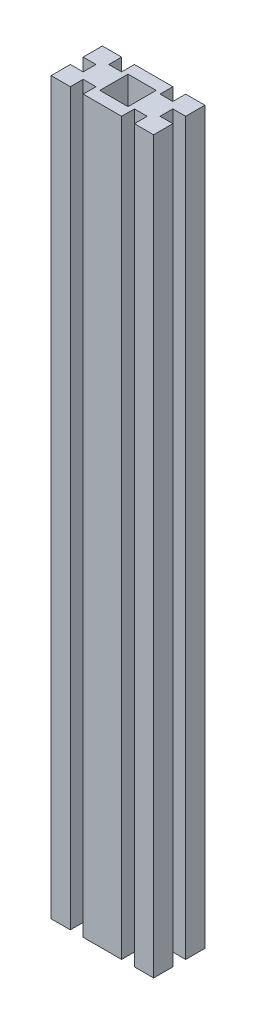
ISO-10303-21;
HEADER;
FILE_DESCRIPTION(('STEP AP214'),'2;1');
FILE_NAME('part.step','',(''),(''),'','','');
FILE_SCHEMA(('AUTOMOTIVE_DESIGN { 1 0 10303 214 1 1 1 1 }'));
ENDSEC;
DATA;
#1=APPLICATION_CONTEXT('core data for automotive mechanical design processes');
#2=APPLICATION_PROTOCOL_DEFINITION('international standard','automotive_design',2000,#1);
#3=PRODUCT_CONTEXT('',#1,'mechanical');
#4=PRODUCT('Part','Part','',(#3));
#5=PRODUCT_RELATED_PRODUCT_CATEGORY('part','',(#4));
#6=PRODUCT_DEFINITION_FORMATION('','',#4);
#7=PRODUCT_DEFINITION_CONTEXT('part definition',#1,'design');
#8=PRODUCT_DEFINITION('design','',#6,#7);
#9=PRODUCT_DEFINITION_SHAPE('','',#8);
#10=(LENGTH_UNIT() NAMED_UNIT(*) SI_UNIT(.MILLI.,.METRE.));
#11=(NAMED_UNIT(*) PLANE_ANGLE_UNIT() SI_UNIT($,.RADIAN.));
#12=(NAMED_UNIT(*) SI_UNIT($,.STERADIAN.) SOLID_ANGLE_UNIT());
#13=UNCERTAINTY_MEASURE_WITH_UNIT(LENGTH_MEASURE(1.E-05),#10,'distance_accuracy_value','');
#14=(GEOMETRIC_REPRESENTATION_CONTEXT(3) GLOBAL_UNCERTAINTY_ASSIGNED_CONTEXT((#13)) GLOBAL_UNIT_ASSIGNED_CONTEXT((#10,
#11,#12)) REPRESENTATION_CONTEXT('',''));
#15=CARTESIAN_POINT('',(0.,0.,0.));
#16=DIRECTION('',(0.,0.,1.));
#17=DIRECTION('',(1.,0.,0.));
#18=AXIS2_PLACEMENT_3D('',#15,#16,#17);
#19=CARTESIAN_POINT('',(-20.,285.,10.));
#20=DIRECTION('',(1.,0.,0.));
#21=DIRECTION('',(0.,0.,-1.));
#22=AXIS2_PLACEMENT_3D('',#19,#20,#21);
#23=PLANE('',#22);
#24=DIRECTION('',(0.,0.,1.));
#25=VECTOR('',#24,1.);
#26=CARTESIAN_POINT('',(-20.,0.,10.));
#27=LINE('',#26,#25);
#28=CARTESIAN_POINT('',(-20.,0.,-10.));
#29=VERTEX_POINT('',#28);
#30=CARTESIAN_POINT('',(-20.,0.,-2.5));
#31=VERTEX_POINT('',#30);
#32=EDGE_CURVE('E318',#29,#31,#27,.T.);
#33=ORIENTED_EDGE('',*,*,#32,.T.);
#34=DIRECTION('',(0.,1.,0.));
#35=VECTOR('',#34,1.);
#36=CARTESIAN_POINT('',(-20.,0.,-2.5));
#37=LINE('',#36,#35);
#38=CARTESIAN_POINT('',(-20.,285.,-2.5));
#39=VERTEX_POINT('',#38);
#40=EDGE_CURVE('E356',#31,#39,#37,.T.);
#41=ORIENTED_EDGE('',*,*,#40,.T.);
#42=DIRECTION('',(0.,0.,1.));
#43=VECTOR('',#42,1.);
#44=CARTESIAN_POINT('',(-20.,285.,10.));
#45=LINE('',#44,#43);
#46=CARTESIAN_POINT('',(-20.,285.,-10.));
#47=VERTEX_POINT('',#46);
#48=EDGE_CURVE('E337',#47,#39,#45,.T.);
#49=ORIENTED_EDGE('',*,*,#48,.F.);
#50=DIRECTION('',(0.,-1.,0.));
#51=VECTOR('',#50,1.);
#52=CARTESIAN_POINT('',(-20.,285.,-10.));
#53=LINE('',#52,#51);
#54=EDGE_CURVE('E281',#47,#29,#53,.T.);
#55=ORIENTED_EDGE('',*,*,#54,.T.);
#56=EDGE_LOOP('',(#33,#41,#49,#55));
#57=FACE_BOUND('',#56,.T.);
#58=ADVANCED_FACE('F35',(#57),#23,.F.);
#59=CARTESIAN_POINT('',(20.,285.,9.99999999999999));
#60=DIRECTION('',(0.,0.,-1.));
#61=DIRECTION('',(-1.,0.,0.));
#62=AXIS2_PLACEMENT_3D('',#59,#60,#61);
#63=PLANE('',#62);
#64=DIRECTION('',(1.,0.,0.));
#65=VECTOR('',#64,1.);
#66=CARTESIAN_POINT('',(20.,0.,9.99999999999999));
#67=LINE('',#66,#65);
#68=CARTESIAN_POINT('',(-20.,0.,10.));
#69=VERTEX_POINT('',#68);
#70=CARTESIAN_POINT('',(-12.5,0.,10.));
#71=VERTEX_POINT('',#70);
#72=EDGE_CURVE('E306',#69,#71,#67,.T.);
#73=ORIENTED_EDGE('',*,*,#72,.T.);
#74=DIRECTION('',(0.,1.,0.));
#75=VECTOR('',#74,1.);
#76=CARTESIAN_POINT('',(-12.5,0.,10.));
#77=LINE('',#76,#75);
#78=CARTESIAN_POINT('',(-12.5,285.,10.));
#79=VERTEX_POINT('',#78);
#80=EDGE_CURVE('E411',#71,#79,#77,.T.);
#81=ORIENTED_EDGE('',*,*,#80,.T.);
#82=DIRECTION('',(1.,0.,0.));
#83=VECTOR('',#82,1.);
#84=CARTESIAN_POINT('',(20.,285.,9.99999999999999));
#85=LINE('',#84,#83);
#86=CARTESIAN_POINT('',(-20.,285.,10.));
#87=VERTEX_POINT('',#86);
#88=EDGE_CURVE('E332',#87,#79,#85,.T.);
#89=ORIENTED_EDGE('',*,*,#88,.F.);
#90=DIRECTION('',(0.,-1.,0.));
#91=VECTOR('',#90,1.);
#92=CARTESIAN_POINT('',(-20.,285.,10.));
#93=LINE('',#92,#91);
#94=EDGE_CURVE('E11',#87,#69,#93,.T.);
#95=ORIENTED_EDGE('',*,*,#94,.T.);
#96=EDGE_LOOP('',(#73,#81,#89,#95));
#97=FACE_BOUND('',#96,.T.);
#98=ADVANCED_FACE('F549',(#97),#63,.F.);
#99=CARTESIAN_POINT('',(-7.5,285.,10.));
#100=VERTEX_POINT('',#99);
#101=CARTESIAN_POINT('',(7.5,285.,10.));
#102=VERTEX_POINT('',#101);
#103=EDGE_CURVE('E335',#100,#102,#85,.T.);
#104=ORIENTED_EDGE('',*,*,#103,.F.);
#105=DIRECTION('',(0.,1.,0.));
#106=VECTOR('',#105,1.);
#107=CARTESIAN_POINT('',(-7.5,0.,10.));
#108=LINE('',#107,#106);
#109=CARTESIAN_POINT('',(-7.5,0.,10.));
#110=VERTEX_POINT('',#109);
#111=EDGE_CURVE('E413',#110,#100,#108,.T.);
#112=ORIENTED_EDGE('',*,*,#111,.F.);
#113=CARTESIAN_POINT('',(7.5,0.,10.));
#114=VERTEX_POINT('',#113);
#115=EDGE_CURVE('E312',#110,#114,#67,.T.);
#116=ORIENTED_EDGE('',*,*,#115,.T.);
#117=DIRECTION('',(0.,1.,0.));
#118=VECTOR('',#117,1.);
#119=CARTESIAN_POINT('',(7.5,0.,10.));
#120=LINE('',#119,#118);
#121=EDGE_CURVE('E393',#114,#102,#120,.T.);
#122=ORIENTED_EDGE('',*,*,#121,.T.);
#123=EDGE_LOOP('',(#104,#112,#116,#122));
#124=FACE_BOUND('',#123,.T.);
#125=ADVANCED_FACE('F537',(#124),#63,.F.);
#126=CARTESIAN_POINT('',(20.,285.,9.99999999999999));
#127=DIRECTION('',(-1.,0.,0.));
#128=DIRECTION('',(0.,0.,1.));
#129=AXIS2_PLACEMENT_3D('',#126,#127,#128);
#130=PLANE('',#129);
#131=DIRECTION('',(0.,0.,-1.));
#132=VECTOR('',#131,1.);
#133=CARTESIAN_POINT('',(20.,285.,9.99999999999999));
#134=LINE('',#133,#132);
#135=CARTESIAN_POINT('',(20.,285.,-2.5));
#136=VERTEX_POINT('',#135);
#137=CARTESIAN_POINT('',(20.,285.,-10.));
#138=VERTEX_POINT('',#137);
#139=EDGE_CURVE('E331',#136,#138,#134,.T.);
#140=ORIENTED_EDGE('',*,*,#139,.F.);
#141=DIRECTION('',(0.,1.,0.));
#142=VECTOR('',#141,1.);
#143=CARTESIAN_POINT('',(20.,0.,-2.5));
#144=LINE('',#143,#142);
#145=CARTESIAN_POINT('',(20.,0.,-2.5));
#146=VERTEX_POINT('',#145);
#147=EDGE_CURVE('E368',#146,#136,#144,.T.);
#148=ORIENTED_EDGE('',*,*,#147,.F.);
#149=DIRECTION('',(0.,0.,-1.));
#150=VECTOR('',#149,1.);
#151=CARTESIAN_POINT('',(20.,0.,9.99999999999999));
#152=LINE('',#151,#150);
#153=CARTESIAN_POINT('',(20.,0.,-10.));
#154=VERTEX_POINT('',#153);
#155=EDGE_CURVE('E305',#146,#154,#152,.T.);
#156=ORIENTED_EDGE('',*,*,#155,.T.);
#157=DIRECTION('',(0.,-1.,0.));
#158=VECTOR('',#157,1.);
#159=CARTESIAN_POINT('',(20.,285.,-10.));
#160=LINE('',#159,#158);
#161=EDGE_CURVE('E284',#138,#154,#160,.T.);
#162=ORIENTED_EDGE('',*,*,#161,.F.);
#163=EDGE_LOOP('',(#140,#148,#156,#162));
#164=FACE_BOUND('',#163,.T.);
#165=ADVANCED_FACE('F518',(#164),#130,.F.);
#166=CARTESIAN_POINT('',(20.,285.,-10.));
#167=DIRECTION('',(0.,0.,1.));
#168=DIRECTION('',(1.,0.,0.));
#169=AXIS2_PLACEMENT_3D('',#166,#167,#168);
#170=PLANE('',#169);
#171=DIRECTION('',(-1.,0.,0.));
#172=VECTOR('',#171,1.);
#173=CARTESIAN_POINT('',(20.,0.,-10.));
#174=LINE('',#173,#172);
#175=CARTESIAN_POINT('',(12.5,0.,-10.));
#176=VERTEX_POINT('',#175);
#177=EDGE_CURVE('E272',#154,#176,#174,.T.);
#178=ORIENTED_EDGE('',*,*,#177,.T.);
#179=DIRECTION('',(0.,1.,0.));
#180=VECTOR('',#179,1.);
#181=CARTESIAN_POINT('',(12.5,0.,-10.));
#182=LINE('',#181,#180);
#183=CARTESIAN_POINT('',(12.5,285.,-10.));
#184=VERTEX_POINT('',#183);
#185=EDGE_CURVE('E380',#176,#184,#182,.T.);
#186=ORIENTED_EDGE('',*,*,#185,.T.);
#187=DIRECTION('',(-1.,0.,0.));
#188=VECTOR('',#187,1.);
#189=CARTESIAN_POINT('',(20.,285.,-10.));
#190=LINE('',#189,#188);
#191=EDGE_CURVE('E285',#138,#184,#190,.T.);
#192=ORIENTED_EDGE('',*,*,#191,.F.);
#193=ORIENTED_EDGE('',*,*,#161,.T.);
#194=EDGE_LOOP('',(#178,#186,#192,#193));
#195=FACE_BOUND('',#194,.T.);
#196=ADVANCED_FACE('F510',(#195),#170,.F.);
#197=CARTESIAN_POINT('',(-12.5,285.,-10.));
#198=VERTEX_POINT('',#197);
#199=EDGE_CURVE('E329',#198,#47,#190,.T.);
#200=ORIENTED_EDGE('',*,*,#199,.F.);
#201=DIRECTION('',(0.,1.,0.));
#202=VECTOR('',#201,1.);
#203=CARTESIAN_POINT('',(-12.5,0.,-10.));
#204=LINE('',#203,#202);
#205=CARTESIAN_POINT('',(-12.5,0.,-10.));
#206=VERTEX_POINT('',#205);
#207=EDGE_CURVE('E325',#206,#198,#204,.T.);
#208=ORIENTED_EDGE('',*,*,#207,.F.);
#209=EDGE_CURVE('E273',#206,#29,#174,.T.);
#210=ORIENTED_EDGE('',*,*,#209,.T.);
#211=ORIENTED_EDGE('',*,*,#54,.F.);
#212=EDGE_LOOP('',(#200,#208,#210,#211));
#213=FACE_BOUND('',#212,.T.);
#214=ADVANCED_FACE('F555',(#213),#170,.F.);
#215=CARTESIAN_POINT('',(-20.,285.,2.5));
#216=VERTEX_POINT('',#215);
#217=EDGE_CURVE('E276',#216,#87,#45,.T.);
#218=ORIENTED_EDGE('',*,*,#217,.F.);
#219=DIRECTION('',(0.,1.,0.));
#220=VECTOR('',#219,1.);
#221=CARTESIAN_POINT('',(-20.,0.,2.5));
#222=LINE('',#221,#220);
#223=CARTESIAN_POINT('',(-20.,0.,2.5));
#224=VERTEX_POINT('',#223);
#225=EDGE_CURVE('E436',#224,#216,#222,.T.);
#226=ORIENTED_EDGE('',*,*,#225,.F.);
#227=EDGE_CURVE('E321',#224,#69,#27,.T.);
#228=ORIENTED_EDGE('',*,*,#227,.T.);
#229=ORIENTED_EDGE('',*,*,#94,.F.);
#230=EDGE_LOOP('',(#218,#226,#228,#229));
#231=FACE_BOUND('',#230,.T.);
#232=ADVANCED_FACE('F37',(#231),#23,.F.);
#233=CARTESIAN_POINT('',(12.5,285.,10.));
#234=VERTEX_POINT('',#233);
#235=CARTESIAN_POINT('',(20.,285.,9.99999999999999));
#236=VERTEX_POINT('',#235);
#237=EDGE_CURVE('E336',#234,#236,#85,.T.);
#238=ORIENTED_EDGE('',*,*,#237,.F.);
#239=DIRECTION('',(0.,1.,0.));
#240=VECTOR('',#239,1.);
#241=CARTESIAN_POINT('',(12.5,0.,10.));
#242=LINE('',#241,#240);
#243=CARTESIAN_POINT('',(12.5,0.,10.));
#244=VERTEX_POINT('',#243);
#245=EDGE_CURVE('E386',#244,#234,#242,.T.);
#246=ORIENTED_EDGE('',*,*,#245,.F.);
#247=CARTESIAN_POINT('',(20.,0.,9.99999999999999));
#248=VERTEX_POINT('',#247);
#249=EDGE_CURVE('E302',#244,#248,#67,.T.);
#250=ORIENTED_EDGE('',*,*,#249,.T.);
#251=DIRECTION('',(0.,-1.,0.));
#252=VECTOR('',#251,1.);
#253=CARTESIAN_POINT('',(20.,285.,9.99999999999999));
#254=LINE('',#253,#252);
#255=EDGE_CURVE('E43',#236,#248,#254,.T.);
#256=ORIENTED_EDGE('',*,*,#255,.F.);
#257=EDGE_LOOP('',(#238,#246,#250,#256));
#258=FACE_BOUND('',#257,.T.);
#259=ADVANCED_FACE('F547',(#258),#63,.F.);
#260=CARTESIAN_POINT('',(20.,0.,2.5));
#261=VERTEX_POINT('',#260);
#262=EDGE_CURVE('E277',#248,#261,#152,.T.);
#263=ORIENTED_EDGE('',*,*,#262,.T.);
#264=DIRECTION('',(0.,1.,0.));
#265=VECTOR('',#264,1.);
#266=CARTESIAN_POINT('',(20.,0.,2.5));
#267=LINE('',#266,#265);
#268=CARTESIAN_POINT('',(20.,285.,2.5));
#269=VERTEX_POINT('',#268);
#270=EDGE_CURVE('E366',#261,#269,#267,.T.);
#271=ORIENTED_EDGE('',*,*,#270,.T.);
#272=EDGE_CURVE('E296',#236,#269,#134,.T.);
#273=ORIENTED_EDGE('',*,*,#272,.F.);
#274=ORIENTED_EDGE('',*,*,#255,.T.);
#275=EDGE_LOOP('',(#263,#271,#273,#274));
#276=FACE_BOUND('',#275,.T.);
#277=ADVANCED_FACE('F293',(#276),#130,.F.);
#278=CARTESIAN_POINT('',(7.5,285.,-10.));
#279=VERTEX_POINT('',#278);
#280=CARTESIAN_POINT('',(-7.5,285.,-10.));
#281=VERTEX_POINT('',#280);
#282=EDGE_CURVE('E264',#279,#281,#190,.T.);
#283=ORIENTED_EDGE('',*,*,#282,.F.);
#284=DIRECTION('',(0.,1.,0.));
#285=VECTOR('',#284,1.);
#286=CARTESIAN_POINT('',(7.5,0.,-10.));
#287=LINE('',#286,#285);
#288=CARTESIAN_POINT('',(7.5,0.,-10.));
#289=VERTEX_POINT('',#288);
#290=EDGE_CURVE('E248',#289,#279,#287,.T.);
#291=ORIENTED_EDGE('',*,*,#290,.F.);
#292=CARTESIAN_POINT('',(-7.5,0.,-10.));
#293=VERTEX_POINT('',#292);
#294=EDGE_CURVE('E262',#289,#293,#174,.T.);
#295=ORIENTED_EDGE('',*,*,#294,.T.);
#296=DIRECTION('',(0.,1.,0.));
#297=VECTOR('',#296,1.);
#298=CARTESIAN_POINT('',(-7.5,0.,-10.));
#299=LINE('',#298,#297);
#300=EDGE_CURVE('E344',#293,#281,#299,.T.);
#301=ORIENTED_EDGE('',*,*,#300,.T.);
#302=EDGE_LOOP('',(#283,#291,#295,#301));
#303=FACE_BOUND('',#302,.T.);
#304=ADVANCED_FACE('F260',(#303),#170,.F.);
#305=CARTESIAN_POINT('',(0.,285.,0.));
#306=DIRECTION('',(0.,1.,0.));
#307=DIRECTION('',(0.,0.,1.));
#308=AXIS2_PLACEMENT_3D('',#305,#306,#307);
#309=PLANE('',#308);
#310=DIRECTION('',(-1.,0.,0.));
#311=VECTOR('',#310,1.);
#312=CARTESIAN_POINT('',(-20.,285.,-2.5));
#313=LINE('',#312,#311);
#314=CARTESIAN_POINT('',(-15.,285.,-2.5));
#315=VERTEX_POINT('',#314);
#316=EDGE_CURVE('E444',#315,#39,#313,.T.);
#317=ORIENTED_EDGE('',*,*,#316,.F.);
#318=DIRECTION('',(0.,0.,-1.));
#319=VECTOR('',#318,1.);
#320=CARTESIAN_POINT('',(-15.,285.,-2.5));
#321=LINE('',#320,#319);
#322=CARTESIAN_POINT('',(-15.,285.,2.5));
#323=VERTEX_POINT('',#322);
#324=EDGE_CURVE('E447',#323,#315,#321,.T.);
#325=ORIENTED_EDGE('',*,*,#324,.F.);
#326=DIRECTION('',(1.,0.,0.));
#327=VECTOR('',#326,1.);
#328=CARTESIAN_POINT('',(-20.,285.,2.5));
#329=LINE('',#328,#327);
#330=EDGE_CURVE('E420',#216,#323,#329,.T.);
#331=ORIENTED_EDGE('',*,*,#330,.F.);
#332=ORIENTED_EDGE('',*,*,#217,.T.);
#333=ORIENTED_EDGE('',*,*,#88,.T.);
#334=DIRECTION('',(0.,0.,1.));
#335=VECTOR('',#334,1.);
#336=CARTESIAN_POINT('',(-12.5,285.,10.));
#337=LINE('',#336,#335);
#338=CARTESIAN_POINT('',(-12.5,285.,5.));
#339=VERTEX_POINT('',#338);
#340=EDGE_CURVE('E396',#339,#79,#337,.T.);
#341=ORIENTED_EDGE('',*,*,#340,.F.);
#342=DIRECTION('',(-1.,0.,0.));
#343=VECTOR('',#342,1.);
#344=CARTESIAN_POINT('',(-12.5,285.,5.));
#345=LINE('',#344,#343);
#346=CARTESIAN_POINT('',(-7.5,285.,5.));
#347=VERTEX_POINT('',#346);
#348=EDGE_CURVE('E421',#347,#339,#345,.T.);
#349=ORIENTED_EDGE('',*,*,#348,.F.);
#350=DIRECTION('',(0.,0.,-1.));
#351=VECTOR('',#350,1.);
#352=CARTESIAN_POINT('',(-7.5,285.,10.));
#353=LINE('',#352,#351);
#354=EDGE_CURVE('E425',#100,#347,#353,.T.);
#355=ORIENTED_EDGE('',*,*,#354,.F.);
#356=ORIENTED_EDGE('',*,*,#103,.T.);
#357=DIRECTION('',(0.,0.,1.));
#358=VECTOR('',#357,1.);
#359=CARTESIAN_POINT('',(7.5,285.,10.));
#360=LINE('',#359,#358);
#361=CARTESIAN_POINT('',(7.5,285.,5.));
#362=VERTEX_POINT('',#361);
#363=EDGE_CURVE('E397',#362,#102,#360,.T.);
#364=ORIENTED_EDGE('',*,*,#363,.F.);
#365=DIRECTION('',(-1.,0.,0.));
#366=VECTOR('',#365,1.);
#367=CARTESIAN_POINT('',(12.5,285.,5.));
#368=LINE('',#367,#366);
#369=CARTESIAN_POINT('',(12.5,285.,5.));
#370=VERTEX_POINT('',#369);
#371=EDGE_CURVE('E400',#370,#362,#368,.T.);
#372=ORIENTED_EDGE('',*,*,#371,.F.);
#373=DIRECTION('',(0.,0.,-1.));
#374=VECTOR('',#373,1.);
#375=CARTESIAN_POINT('',(12.5,285.,10.));
#376=LINE('',#375,#374);
#377=EDGE_CURVE('E370',#234,#370,#376,.T.);
#378=ORIENTED_EDGE('',*,*,#377,.F.);
#379=ORIENTED_EDGE('',*,*,#237,.T.);
#380=ORIENTED_EDGE('',*,*,#272,.T.);
#381=DIRECTION('',(1.,0.,0.));
#382=VECTOR('',#381,1.);
#383=CARTESIAN_POINT('',(20.,285.,2.5));
#384=LINE('',#383,#382);
#385=CARTESIAN_POINT('',(15.,285.,2.5));
#386=VERTEX_POINT('',#385);
#387=EDGE_CURVE('E371',#386,#269,#384,.T.);
#388=ORIENTED_EDGE('',*,*,#387,.F.);
#389=DIRECTION('',(0.,0.,1.));
#390=VECTOR('',#389,1.);
#391=CARTESIAN_POINT('',(15.,285.,-2.5));
#392=LINE('',#391,#390);
#393=CARTESIAN_POINT('',(15.,285.,-2.5));
#394=VERTEX_POINT('',#393);
#395=EDGE_CURVE('E374',#394,#386,#392,.T.);
#396=ORIENTED_EDGE('',*,*,#395,.F.);
#397=DIRECTION('',(-1.,0.,0.));
#398=VECTOR('',#397,1.);
#399=CARTESIAN_POINT('',(20.,285.,-2.5));
#400=LINE('',#399,#398);
#401=EDGE_CURVE('E377',#136,#394,#400,.T.);
#402=ORIENTED_EDGE('',*,*,#401,.F.);
#403=ORIENTED_EDGE('',*,*,#139,.T.);
#404=ORIENTED_EDGE('',*,*,#191,.T.);
#405=DIRECTION('',(0.,0.,-1.));
#406=VECTOR('',#405,1.);
#407=CARTESIAN_POINT('',(12.5,285.,-10.));
#408=LINE('',#407,#406);
#409=CARTESIAN_POINT('',(12.5,285.,-5.00000000000001));
#410=VERTEX_POINT('',#409);
#411=EDGE_CURVE('E255',#410,#184,#408,.T.);
#412=ORIENTED_EDGE('',*,*,#411,.F.);
#413=DIRECTION('',(1.,0.,0.));
#414=VECTOR('',#413,1.);
#415=CARTESIAN_POINT('',(12.5,285.,-5.00000000000001));
#416=LINE('',#415,#414);
#417=CARTESIAN_POINT('',(7.5,285.,-5.00000000000001));
#418=VERTEX_POINT('',#417);
#419=EDGE_CURVE('E494',#418,#410,#416,.T.);
#420=ORIENTED_EDGE('',*,*,#419,.F.);
#421=DIRECTION('',(0.,0.,1.));
#422=VECTOR('',#421,1.);
#423=CARTESIAN_POINT('',(7.5,285.,-10.));
#424=LINE('',#423,#422);
#425=EDGE_CURVE('E466',#279,#418,#424,.T.);
#426=ORIENTED_EDGE('',*,*,#425,.F.);
#427=ORIENTED_EDGE('',*,*,#282,.T.);
#428=DIRECTION('',(0.,0.,-1.));
#429=VECTOR('',#428,1.);
#430=CARTESIAN_POINT('',(-7.5,285.,-10.));
#431=LINE('',#430,#429);
#432=CARTESIAN_POINT('',(-7.5,285.,-5.00000000000001));
#433=VERTEX_POINT('',#432);
#434=EDGE_CURVE('E347',#433,#281,#431,.T.);
#435=ORIENTED_EDGE('',*,*,#434,.F.);
#436=DIRECTION('',(1.,0.,0.));
#437=VECTOR('',#436,1.);
#438=CARTESIAN_POINT('',(-12.5,285.,-5.00000000000001));
#439=LINE('',#438,#437);
#440=CARTESIAN_POINT('',(-12.5,285.,-5.00000000000001));
#441=VERTEX_POINT('',#440);
#442=EDGE_CURVE('E350',#441,#433,#439,.T.);
#443=ORIENTED_EDGE('',*,*,#442,.F.);
#444=DIRECTION('',(0.,0.,1.));
#445=VECTOR('',#444,1.);
#446=CARTESIAN_POINT('',(-12.5,285.,-10.));
#447=LINE('',#446,#445);
#448=EDGE_CURVE('E353',#198,#441,#447,.T.);
#449=ORIENTED_EDGE('',*,*,#448,.F.);
#450=ORIENTED_EDGE('',*,*,#199,.T.);
#451=ORIENTED_EDGE('',*,*,#48,.T.);
#452=EDGE_LOOP('',(#317,#325,#331,#332,#333,#341,#349,#355,#356,#364,#372,#378,#379,#380,#388,
#396,#402,#403,#404,#412,#420,#426,#427,#435,#443,#449,#450,#451));
#453=FACE_BOUND('',#452,.T.);
#454=DIRECTION('',(0.,0.,1.));
#455=VECTOR('',#454,1.);
#456=CARTESIAN_POINT('',(-5.5,285.,-5.5));
#457=LINE('',#456,#455);
#458=CARTESIAN_POINT('',(-5.5,285.,-5.5));
#459=VERTEX_POINT('',#458);
#460=CARTESIAN_POINT('',(-5.5,285.,5.5));
#461=VERTEX_POINT('',#460);
#462=EDGE_CURVE('E50',#459,#461,#457,.T.);
#463=ORIENTED_EDGE('',*,*,#462,.F.);
#464=DIRECTION('',(-1.,0.,0.));
#465=VECTOR('',#464,1.);
#466=CARTESIAN_POINT('',(5.5,285.,-5.5));
#467=LINE('',#466,#465);
#468=CARTESIAN_POINT('',(5.5,285.,-5.5));
#469=VERTEX_POINT('',#468);
#470=EDGE_CURVE('E467',#469,#459,#467,.T.);
#471=ORIENTED_EDGE('',*,*,#470,.F.);
#472=DIRECTION('',(0.,0.,-1.));
#473=VECTOR('',#472,1.);
#474=CARTESIAN_POINT('',(5.5,285.,-5.5));
#475=LINE('',#474,#473);
#476=CARTESIAN_POINT('',(5.5,285.,5.5));
#477=VERTEX_POINT('',#476);
#478=EDGE_CURVE('E471',#477,#469,#475,.T.);
#479=ORIENTED_EDGE('',*,*,#478,.F.);
#480=DIRECTION('',(1.,0.,0.));
#481=VECTOR('',#480,1.);
#482=CARTESIAN_POINT('',(5.5,285.,5.5));
#483=LINE('',#482,#481);
#484=EDGE_CURVE('E474',#461,#477,#483,.T.);
#485=ORIENTED_EDGE('',*,*,#484,.F.);
#486=EDGE_LOOP('',(#463,#471,#479,#485));
#487=FACE_BOUND('',#486,.T.);
#488=ADVANCED_FACE('F513',(#453,#487),#309,.T.);
#489=CARTESIAN_POINT('',(0.,0.,0.));
#490=DIRECTION('',(0.,1.,0.));
#491=DIRECTION('',(0.,0.,1.));
#492=AXIS2_PLACEMENT_3D('',#489,#490,#491);
#493=PLANE('',#492);
#494=DIRECTION('',(0.,0.,-1.));
#495=VECTOR('',#494,1.);
#496=CARTESIAN_POINT('',(-15.,0.,-2.5));
#497=LINE('',#496,#495);
#498=CARTESIAN_POINT('',(-15.,0.,2.5));
#499=VERTEX_POINT('',#498);
#500=CARTESIAN_POINT('',(-15.,0.,-2.5));
#501=VERTEX_POINT('',#500);
#502=EDGE_CURVE('E58',#499,#501,#497,.T.);
#503=ORIENTED_EDGE('',*,*,#502,.T.);
#504=DIRECTION('',(-1.,0.,0.));
#505=VECTOR('',#504,1.);
#506=CARTESIAN_POINT('',(-20.,0.,-2.5));
#507=LINE('',#506,#505);
#508=EDGE_CURVE('E439',#501,#31,#507,.T.);
#509=ORIENTED_EDGE('',*,*,#508,.T.);
#510=ORIENTED_EDGE('',*,*,#32,.F.);
#511=ORIENTED_EDGE('',*,*,#209,.F.);
#512=DIRECTION('',(0.,0.,1.));
#513=VECTOR('',#512,1.);
#514=CARTESIAN_POINT('',(-12.5,0.,-10.));
#515=LINE('',#514,#513);
#516=CARTESIAN_POINT('',(-12.5,0.,-5.00000000000001));
#517=VERTEX_POINT('',#516);
#518=EDGE_CURVE('E349',#206,#517,#515,.T.);
#519=ORIENTED_EDGE('',*,*,#518,.T.);
#520=DIRECTION('',(1.,0.,0.));
#521=VECTOR('',#520,1.);
#522=CARTESIAN_POINT('',(-12.5,0.,-5.00000000000001));
#523=LINE('',#522,#521);
#524=CARTESIAN_POINT('',(-7.5,0.,-5.00000000000001));
#525=VERTEX_POINT('',#524);
#526=EDGE_CURVE('E358',#517,#525,#523,.T.);
#527=ORIENTED_EDGE('',*,*,#526,.T.);
#528=DIRECTION('',(0.,0.,-1.));
#529=VECTOR('',#528,1.);
#530=CARTESIAN_POINT('',(-7.5,0.,-10.));
#531=LINE('',#530,#529);
#532=EDGE_CURVE('E271',#525,#293,#531,.T.);
#533=ORIENTED_EDGE('',*,*,#532,.T.);
#534=ORIENTED_EDGE('',*,*,#294,.F.);
#535=DIRECTION('',(0.,0.,1.));
#536=VECTOR('',#535,1.);
#537=CARTESIAN_POINT('',(7.5,0.,-10.));
#538=LINE('',#537,#536);
#539=CARTESIAN_POINT('',(7.5,0.,-5.00000000000001));
#540=VERTEX_POINT('',#539);
#541=EDGE_CURVE('E244',#289,#540,#538,.T.);
#542=ORIENTED_EDGE('',*,*,#541,.T.);
#543=DIRECTION('',(1.,0.,0.));
#544=VECTOR('',#543,1.);
#545=CARTESIAN_POINT('',(12.5,0.,-5.00000000000001));
#546=LINE('',#545,#544);
#547=CARTESIAN_POINT('',(12.5,0.,-5.00000000000001));
#548=VERTEX_POINT('',#547);
#549=EDGE_CURVE('E254',#540,#548,#546,.T.);
#550=ORIENTED_EDGE('',*,*,#549,.T.);
#551=DIRECTION('',(0.,0.,-1.));
#552=VECTOR('',#551,1.);
#553=CARTESIAN_POINT('',(12.5,0.,-10.));
#554=LINE('',#553,#552);
#555=EDGE_CURVE('E265',#548,#176,#554,.T.);
#556=ORIENTED_EDGE('',*,*,#555,.T.);
#557=ORIENTED_EDGE('',*,*,#177,.F.);
#558=ORIENTED_EDGE('',*,*,#155,.F.);
#559=DIRECTION('',(-1.,0.,0.));
#560=VECTOR('',#559,1.);
#561=CARTESIAN_POINT('',(20.,0.,-2.5));
#562=LINE('',#561,#560);
#563=CARTESIAN_POINT('',(15.,0.,-2.5));
#564=VERTEX_POINT('',#563);
#565=EDGE_CURVE('E373',#146,#564,#562,.T.);
#566=ORIENTED_EDGE('',*,*,#565,.T.);
#567=DIRECTION('',(0.,0.,1.));
#568=VECTOR('',#567,1.);
#569=CARTESIAN_POINT('',(15.,0.,-2.5));
#570=LINE('',#569,#568);
#571=CARTESIAN_POINT('',(15.,0.,2.5));
#572=VERTEX_POINT('',#571);
#573=EDGE_CURVE('E382',#564,#572,#570,.T.);
#574=ORIENTED_EDGE('',*,*,#573,.T.);
#575=DIRECTION('',(1.,0.,0.));
#576=VECTOR('',#575,1.);
#577=CARTESIAN_POINT('',(20.,0.,2.5));
#578=LINE('',#577,#576);
#579=EDGE_CURVE('E304',#572,#261,#578,.T.);
#580=ORIENTED_EDGE('',*,*,#579,.T.);
#581=ORIENTED_EDGE('',*,*,#262,.F.);
#582=ORIENTED_EDGE('',*,*,#249,.F.);
#583=DIRECTION('',(0.,0.,-1.));
#584=VECTOR('',#583,1.);
#585=CARTESIAN_POINT('',(12.5,0.,10.));
#586=LINE('',#585,#584);
#587=CARTESIAN_POINT('',(12.5,0.,5.));
#588=VERTEX_POINT('',#587);
#589=EDGE_CURVE('E399',#244,#588,#586,.T.);
#590=ORIENTED_EDGE('',*,*,#589,.T.);
#591=DIRECTION('',(-1.,0.,0.));
#592=VECTOR('',#591,1.);
#593=CARTESIAN_POINT('',(12.5,0.,5.));
#594=LINE('',#593,#592);
#595=CARTESIAN_POINT('',(7.5,0.,5.));
#596=VERTEX_POINT('',#595);
#597=EDGE_CURVE('E407',#588,#596,#594,.T.);
#598=ORIENTED_EDGE('',*,*,#597,.T.);
#599=DIRECTION('',(0.,0.,1.));
#600=VECTOR('',#599,1.);
#601=CARTESIAN_POINT('',(7.5,0.,10.));
#602=LINE('',#601,#600);
#603=EDGE_CURVE('E389',#596,#114,#602,.T.);
#604=ORIENTED_EDGE('',*,*,#603,.T.);
#605=ORIENTED_EDGE('',*,*,#115,.F.);
#606=DIRECTION('',(0.,0.,-1.));
#607=VECTOR('',#606,1.);
#608=CARTESIAN_POINT('',(-7.5,0.,10.));
#609=LINE('',#608,#607);
#610=CARTESIAN_POINT('',(-7.5,0.,5.));
#611=VERTEX_POINT('',#610);
#612=EDGE_CURVE('E431',#110,#611,#609,.T.);
#613=ORIENTED_EDGE('',*,*,#612,.T.);
#614=DIRECTION('',(-1.,0.,0.));
#615=VECTOR('',#614,1.);
#616=CARTESIAN_POINT('',(-12.5,0.,5.));
#617=LINE('',#616,#615);
#618=CARTESIAN_POINT('',(-12.5,0.,5.));
#619=VERTEX_POINT('',#618);
#620=EDGE_CURVE('E414',#611,#619,#617,.T.);
#621=ORIENTED_EDGE('',*,*,#620,.T.);
#622=DIRECTION('',(0.,0.,1.));
#623=VECTOR('',#622,1.);
#624=CARTESIAN_POINT('',(-12.5,0.,10.));
#625=LINE('',#624,#623);
#626=EDGE_CURVE('E424',#619,#71,#625,.T.);
#627=ORIENTED_EDGE('',*,*,#626,.T.);
#628=ORIENTED_EDGE('',*,*,#72,.F.);
#629=ORIENTED_EDGE('',*,*,#227,.F.);
#630=DIRECTION('',(1.,0.,0.));
#631=VECTOR('',#630,1.);
#632=CARTESIAN_POINT('',(-20.,0.,2.5));
#633=LINE('',#632,#631);
#634=EDGE_CURVE('E446',#224,#499,#633,.T.);
#635=ORIENTED_EDGE('',*,*,#634,.T.);
#636=EDGE_LOOP('',(#503,#509,#510,#511,#519,#527,#533,#534,#542,#550,#556,#557,#558,#566,#574,
#580,#581,#582,#590,#598,#604,#605,#613,#621,#627,#628,#629,#635));
#637=FACE_BOUND('',#636,.T.);
#638=DIRECTION('',(-1.,0.,0.));
#639=VECTOR('',#638,1.);
#640=CARTESIAN_POINT('',(5.5,0.,-5.5));
#641=LINE('',#640,#639);
#642=CARTESIAN_POINT('',(5.5,0.,-5.5));
#643=VERTEX_POINT('',#642);
#644=CARTESIAN_POINT('',(-5.5,0.,-5.5));
#645=VERTEX_POINT('',#644);
#646=EDGE_CURVE('E460',#643,#645,#641,.T.);
#647=ORIENTED_EDGE('',*,*,#646,.T.);
#648=DIRECTION('',(0.,0.,1.));
#649=VECTOR('',#648,1.);
#650=CARTESIAN_POINT('',(-5.5,0.,-5.5));
#651=LINE('',#650,#649);
#652=CARTESIAN_POINT('',(-5.5,0.,5.5));
#653=VERTEX_POINT('',#652);
#654=EDGE_CURVE('E470',#645,#653,#651,.T.);
#655=ORIENTED_EDGE('',*,*,#654,.T.);
#656=DIRECTION('',(1.,0.,0.));
#657=VECTOR('',#656,1.);
#658=CARTESIAN_POINT('',(5.5,0.,5.5));
#659=LINE('',#658,#657);
#660=CARTESIAN_POINT('',(5.5,0.,5.5));
#661=VERTEX_POINT('',#660);
#662=EDGE_CURVE('E483',#653,#661,#659,.T.);
#663=ORIENTED_EDGE('',*,*,#662,.T.);
#664=DIRECTION('',(0.,0.,-1.));
#665=VECTOR('',#664,1.);
#666=CARTESIAN_POINT('',(5.5,0.,-5.5));
#667=LINE('',#666,#665);
#668=EDGE_CURVE('E480',#661,#643,#667,.T.);
#669=ORIENTED_EDGE('',*,*,#668,.T.);
#670=EDGE_LOOP('',(#647,#655,#663,#669));
#671=FACE_BOUND('',#670,.T.);
#672=ADVANCED_FACE('F268',(#637,#671),#493,.F.);
#673=CARTESIAN_POINT('',(-12.5,0.,-10.));
#674=DIRECTION('',(-1.,0.,0.));
#675=DIRECTION('',(0.,0.,1.));
#676=AXIS2_PLACEMENT_3D('',#673,#674,#675);
#677=PLANE('',#676);
#678=ORIENTED_EDGE('',*,*,#448,.T.);
#679=DIRECTION('',(0.,1.,0.));
#680=VECTOR('',#679,1.);
#681=CARTESIAN_POINT('',(-12.5,0.,-5.00000000000001));
#682=LINE('',#681,#680);
#683=EDGE_CURVE('E340',#517,#441,#682,.T.);
#684=ORIENTED_EDGE('',*,*,#683,.F.);
#685=ORIENTED_EDGE('',*,*,#518,.F.);
#686=ORIENTED_EDGE('',*,*,#207,.T.);
#687=EDGE_LOOP('',(#678,#684,#685,#686));
#688=FACE_BOUND('',#687,.T.);
#689=ADVANCED_FACE('F625',(#688),#677,.F.);
#690=CARTESIAN_POINT('',(-7.5,0.,-10.));
#691=DIRECTION('',(1.,0.,0.));
#692=DIRECTION('',(0.,0.,-1.));
#693=AXIS2_PLACEMENT_3D('',#690,#691,#692);
#694=PLANE('',#693);
#695=ORIENTED_EDGE('',*,*,#434,.T.);
#696=ORIENTED_EDGE('',*,*,#300,.F.);
#697=ORIENTED_EDGE('',*,*,#532,.F.);
#698=DIRECTION('',(0.,1.,0.));
#699=VECTOR('',#698,1.);
#700=CARTESIAN_POINT('',(-7.5,0.,-5.00000000000001));
#701=LINE('',#700,#699);
#702=EDGE_CURVE('E342',#525,#433,#701,.T.);
#703=ORIENTED_EDGE('',*,*,#702,.T.);
#704=EDGE_LOOP('',(#695,#696,#697,#703));
#705=FACE_BOUND('',#704,.T.);
#706=ADVANCED_FACE('F634',(#705),#694,.F.);
#707=CARTESIAN_POINT('',(-12.5,0.,-5.00000000000001));
#708=DIRECTION('',(0.,0.,1.));
#709=DIRECTION('',(1.,0.,0.));
#710=AXIS2_PLACEMENT_3D('',#707,#708,#709);
#711=PLANE('',#710);
#712=ORIENTED_EDGE('',*,*,#442,.T.);
#713=ORIENTED_EDGE('',*,*,#702,.F.);
#714=ORIENTED_EDGE('',*,*,#526,.F.);
#715=ORIENTED_EDGE('',*,*,#683,.T.);
#716=EDGE_LOOP('',(#712,#713,#714,#715));
#717=FACE_BOUND('',#716,.T.);
#718=ADVANCED_FACE('F644',(#717),#711,.F.);
#719=CARTESIAN_POINT('',(-5.5,0.,-5.5));
#720=DIRECTION('',(-1.,0.,0.));
#721=DIRECTION('',(0.,0.,1.));
#722=AXIS2_PLACEMENT_3D('',#719,#720,#721);
#723=PLANE('',#722);
#724=ORIENTED_EDGE('',*,*,#462,.T.);
#725=DIRECTION('',(0.,1.,0.));
#726=VECTOR('',#725,1.);
#727=CARTESIAN_POINT('',(-5.5,0.,5.5));
#728=LINE('',#727,#726);
#729=EDGE_CURVE('E457',#653,#461,#728,.T.);
#730=ORIENTED_EDGE('',*,*,#729,.F.);
#731=ORIENTED_EDGE('',*,*,#654,.F.);
#732=DIRECTION('',(0.,1.,0.));
#733=VECTOR('',#732,1.);
#734=CARTESIAN_POINT('',(-5.5,0.,-5.5));
#735=LINE('',#734,#733);
#736=EDGE_CURVE('E464',#645,#459,#735,.T.);
#737=ORIENTED_EDGE('',*,*,#736,.T.);
#738=EDGE_LOOP('',(#724,#730,#731,#737));
#739=FACE_BOUND('',#738,.T.);
#740=ADVANCED_FACE('F654',(#739),#723,.F.);
#741=CARTESIAN_POINT('',(5.5,0.,-5.5));
#742=DIRECTION('',(0.,0.,-1.));
#743=DIRECTION('',(-1.,0.,0.));
#744=AXIS2_PLACEMENT_3D('',#741,#742,#743);
#745=PLANE('',#744);
#746=ORIENTED_EDGE('',*,*,#470,.T.);
#747=ORIENTED_EDGE('',*,*,#736,.F.);
#748=ORIENTED_EDGE('',*,*,#646,.F.);
#749=DIRECTION('',(0.,1.,0.));
#750=VECTOR('',#749,1.);
#751=CARTESIAN_POINT('',(5.5,0.,-5.5));
#752=LINE('',#751,#750);
#753=EDGE_CURVE('E462',#643,#469,#752,.T.);
#754=ORIENTED_EDGE('',*,*,#753,.T.);
#755=EDGE_LOOP('',(#746,#747,#748,#754));
#756=FACE_BOUND('',#755,.T.);
#757=ADVANCED_FACE('F664',(#756),#745,.F.);
#758=CARTESIAN_POINT('',(5.5,0.,-5.5));
#759=DIRECTION('',(1.,0.,0.));
#760=DIRECTION('',(0.,0.,-1.));
#761=AXIS2_PLACEMENT_3D('',#758,#759,#760);
#762=PLANE('',#761);
#763=ORIENTED_EDGE('',*,*,#478,.T.);
#764=ORIENTED_EDGE('',*,*,#753,.F.);
#765=ORIENTED_EDGE('',*,*,#668,.F.);
#766=DIRECTION('',(0.,1.,0.));
#767=VECTOR('',#766,1.);
#768=CARTESIAN_POINT('',(5.5,0.,5.5));
#769=LINE('',#768,#767);
#770=EDGE_CURVE('E459',#661,#477,#769,.T.);
#771=ORIENTED_EDGE('',*,*,#770,.T.);
#772=EDGE_LOOP('',(#763,#764,#765,#771));
#773=FACE_BOUND('',#772,.T.);
#774=ADVANCED_FACE('F673',(#773),#762,.F.);
#775=CARTESIAN_POINT('',(5.5,0.,5.5));
#776=DIRECTION('',(0.,0.,1.));
#777=DIRECTION('',(1.,0.,0.));
#778=AXIS2_PLACEMENT_3D('',#775,#776,#777);
#779=PLANE('',#778);
#780=ORIENTED_EDGE('',*,*,#484,.T.);
#781=ORIENTED_EDGE('',*,*,#770,.F.);
#782=ORIENTED_EDGE('',*,*,#662,.F.);
#783=ORIENTED_EDGE('',*,*,#729,.T.);
#784=EDGE_LOOP('',(#780,#781,#782,#783));
#785=FACE_BOUND('',#784,.T.);
#786=ADVANCED_FACE('F683',(#785),#779,.F.);
#787=CARTESIAN_POINT('',(12.5,0.,-10.));
#788=DIRECTION('',(1.,0.,0.));
#789=DIRECTION('',(0.,0.,-1.));
#790=AXIS2_PLACEMENT_3D('',#787,#788,#789);
#791=PLANE('',#790);
#792=ORIENTED_EDGE('',*,*,#411,.T.);
#793=ORIENTED_EDGE('',*,*,#185,.F.);
#794=ORIENTED_EDGE('',*,*,#555,.F.);
#795=DIRECTION('',(0.,1.,0.));
#796=VECTOR('',#795,1.);
#797=CARTESIAN_POINT('',(12.5,0.,-5.00000000000001));
#798=LINE('',#797,#796);
#799=EDGE_CURVE('E489',#548,#410,#798,.T.);
#800=ORIENTED_EDGE('',*,*,#799,.T.);
#801=EDGE_LOOP('',(#792,#793,#794,#800));
#802=FACE_BOUND('',#801,.T.);
#803=ADVANCED_FACE('F507',(#802),#791,.F.);
#804=CARTESIAN_POINT('',(12.5,0.,-5.00000000000001));
#805=DIRECTION('',(0.,0.,1.));
#806=DIRECTION('',(1.,0.,0.));
#807=AXIS2_PLACEMENT_3D('',#804,#805,#806);
#808=PLANE('',#807);
#809=ORIENTED_EDGE('',*,*,#419,.T.);
#810=ORIENTED_EDGE('',*,*,#799,.F.);
#811=ORIENTED_EDGE('',*,*,#549,.F.);
#812=DIRECTION('',(0.,1.,0.));
#813=VECTOR('',#812,1.);
#814=CARTESIAN_POINT('',(7.5,0.,-5.00000000000001));
#815=LINE('',#814,#813);
#816=EDGE_CURVE('E250',#540,#418,#815,.T.);
#817=ORIENTED_EDGE('',*,*,#816,.T.);
#818=EDGE_LOOP('',(#809,#810,#811,#817));
#819=FACE_BOUND('',#818,.T.);
#820=ADVANCED_FACE('F503',(#819),#808,.F.);
#821=CARTESIAN_POINT('',(7.5,0.,-10.));
#822=DIRECTION('',(-1.,0.,0.));
#823=DIRECTION('',(0.,0.,1.));
#824=AXIS2_PLACEMENT_3D('',#821,#822,#823);
#825=PLANE('',#824);
#826=ORIENTED_EDGE('',*,*,#425,.T.);
#827=ORIENTED_EDGE('',*,*,#816,.F.);
#828=ORIENTED_EDGE('',*,*,#541,.F.);
#829=ORIENTED_EDGE('',*,*,#290,.T.);
#830=EDGE_LOOP('',(#826,#827,#828,#829));
#831=FACE_BOUND('',#830,.T.);
#832=ADVANCED_FACE('F247',(#831),#825,.F.);
#833=CARTESIAN_POINT('',(20.,0.,-2.5));
#834=DIRECTION('',(0.,0.,-1.));
#835=DIRECTION('',(-1.,0.,0.));
#836=AXIS2_PLACEMENT_3D('',#833,#834,#835);
#837=PLANE('',#836);
#838=ORIENTED_EDGE('',*,*,#401,.T.);
#839=DIRECTION('',(0.,1.,0.));
#840=VECTOR('',#839,1.);
#841=CARTESIAN_POINT('',(15.,0.,-2.5));
#842=LINE('',#841,#840);
#843=EDGE_CURVE('E362',#564,#394,#842,.T.);
#844=ORIENTED_EDGE('',*,*,#843,.F.);
#845=ORIENTED_EDGE('',*,*,#565,.F.);
#846=ORIENTED_EDGE('',*,*,#147,.T.);
#847=EDGE_LOOP('',(#838,#844,#845,#846));
#848=FACE_BOUND('',#847,.T.);
#849=ADVANCED_FACE('F521',(#848),#837,.F.);
#850=CARTESIAN_POINT('',(20.,0.,2.5));
#851=DIRECTION('',(0.,0.,1.));
#852=DIRECTION('',(1.,0.,0.));
#853=AXIS2_PLACEMENT_3D('',#850,#851,#852);
#854=PLANE('',#853);
#855=ORIENTED_EDGE('',*,*,#387,.T.);
#856=ORIENTED_EDGE('',*,*,#270,.F.);
#857=ORIENTED_EDGE('',*,*,#579,.F.);
#858=DIRECTION('',(0.,1.,0.));
#859=VECTOR('',#858,1.);
#860=CARTESIAN_POINT('',(15.,0.,2.5));
#861=LINE('',#860,#859);
#862=EDGE_CURVE('E364',#572,#386,#861,.T.);
#863=ORIENTED_EDGE('',*,*,#862,.T.);
#864=EDGE_LOOP('',(#855,#856,#857,#863));
#865=FACE_BOUND('',#864,.T.);
#866=ADVANCED_FACE('F527',(#865),#854,.F.);
#867=CARTESIAN_POINT('',(15.,0.,-2.5));
#868=DIRECTION('',(-1.,0.,0.));
#869=DIRECTION('',(0.,0.,1.));
#870=AXIS2_PLACEMENT_3D('',#867,#868,#869);
#871=PLANE('',#870);
#872=ORIENTED_EDGE('',*,*,#395,.T.);
#873=ORIENTED_EDGE('',*,*,#862,.F.);
#874=ORIENTED_EDGE('',*,*,#573,.F.);
#875=ORIENTED_EDGE('',*,*,#843,.T.);
#876=EDGE_LOOP('',(#872,#873,#874,#875));
#877=FACE_BOUND('',#876,.T.);
#878=ADVANCED_FACE('F524',(#877),#871,.F.);
#879=CARTESIAN_POINT('',(7.5,0.,10.));
#880=DIRECTION('',(-1.,0.,0.));
#881=DIRECTION('',(0.,0.,1.));
#882=AXIS2_PLACEMENT_3D('',#879,#880,#881);
#883=PLANE('',#882);
#884=ORIENTED_EDGE('',*,*,#363,.T.);
#885=ORIENTED_EDGE('',*,*,#121,.F.);
#886=ORIENTED_EDGE('',*,*,#603,.F.);
#887=DIRECTION('',(0.,1.,0.));
#888=VECTOR('',#887,1.);
#889=CARTESIAN_POINT('',(7.5,0.,5.));
#890=LINE('',#889,#888);
#891=EDGE_CURVE('E391',#596,#362,#890,.T.);
#892=ORIENTED_EDGE('',*,*,#891,.T.);
#893=EDGE_LOOP('',(#884,#885,#886,#892));
#894=FACE_BOUND('',#893,.T.);
#895=ADVANCED_FACE('F541',(#894),#883,.F.);
#896=CARTESIAN_POINT('',(12.5,0.,5.));
#897=DIRECTION('',(0.,0.,-1.));
#898=DIRECTION('',(-1.,0.,0.));
#899=AXIS2_PLACEMENT_3D('',#896,#897,#898);
#900=PLANE('',#899);
#901=ORIENTED_EDGE('',*,*,#371,.T.);
#902=ORIENTED_EDGE('',*,*,#891,.F.);
#903=ORIENTED_EDGE('',*,*,#597,.F.);
#904=DIRECTION('',(0.,1.,0.));
#905=VECTOR('',#904,1.);
#906=CARTESIAN_POINT('',(12.5,0.,5.));
#907=LINE('',#906,#905);
#908=EDGE_CURVE('E388',#588,#370,#907,.T.);
#909=ORIENTED_EDGE('',*,*,#908,.T.);
#910=EDGE_LOOP('',(#901,#902,#903,#909));
#911=FACE_BOUND('',#910,.T.);
#912=ADVANCED_FACE('F544',(#911),#900,.F.);
#913=CARTESIAN_POINT('',(12.5,0.,10.));
#914=DIRECTION('',(1.,0.,0.));
#915=DIRECTION('',(0.,0.,-1.));
#916=AXIS2_PLACEMENT_3D('',#913,#914,#915);
#917=PLANE('',#916);
#918=ORIENTED_EDGE('',*,*,#377,.T.);
#919=ORIENTED_EDGE('',*,*,#908,.F.);
#920=ORIENTED_EDGE('',*,*,#589,.F.);
#921=ORIENTED_EDGE('',*,*,#245,.T.);
#922=EDGE_LOOP('',(#918,#919,#920,#921));
#923=FACE_BOUND('',#922,.T.);
#924=ADVANCED_FACE('F546',(#923),#917,.F.);
#925=CARTESIAN_POINT('',(-12.5,0.,10.));
#926=DIRECTION('',(-1.,0.,0.));
#927=DIRECTION('',(0.,0.,1.));
#928=AXIS2_PLACEMENT_3D('',#925,#926,#927);
#929=PLANE('',#928);
#930=ORIENTED_EDGE('',*,*,#340,.T.);
#931=ORIENTED_EDGE('',*,*,#80,.F.);
#932=ORIENTED_EDGE('',*,*,#626,.F.);
#933=DIRECTION('',(0.,1.,0.));
#934=VECTOR('',#933,1.);
#935=CARTESIAN_POINT('',(-12.5,0.,5.));
#936=LINE('',#935,#934);
#937=EDGE_CURVE('E418',#619,#339,#936,.T.);
#938=ORIENTED_EDGE('',*,*,#937,.T.);
#939=EDGE_LOOP('',(#930,#931,#932,#938));
#940=FACE_BOUND('',#939,.T.);
#941=ADVANCED_FACE('F766',(#940),#929,.F.);
#942=CARTESIAN_POINT('',(-12.5,0.,5.));
#943=DIRECTION('',(0.,0.,-1.));
#944=DIRECTION('',(-1.,0.,0.));
#945=AXIS2_PLACEMENT_3D('',#942,#943,#944);
#946=PLANE('',#945);
#947=ORIENTED_EDGE('',*,*,#348,.T.);
#948=ORIENTED_EDGE('',*,*,#937,.F.);
#949=ORIENTED_EDGE('',*,*,#620,.F.);
#950=DIRECTION('',(0.,1.,0.));
#951=VECTOR('',#950,1.);
#952=CARTESIAN_POINT('',(-7.5,0.,5.));
#953=LINE('',#952,#951);
#954=EDGE_CURVE('E416',#611,#347,#953,.T.);
#955=ORIENTED_EDGE('',*,*,#954,.T.);
#956=EDGE_LOOP('',(#947,#948,#949,#955));
#957=FACE_BOUND('',#956,.T.);
#958=ADVANCED_FACE('F775',(#957),#946,.F.);
#959=CARTESIAN_POINT('',(-7.5,0.,10.));
#960=DIRECTION('',(1.,0.,0.));
#961=DIRECTION('',(0.,0.,-1.));
#962=AXIS2_PLACEMENT_3D('',#959,#960,#961);
#963=PLANE('',#962);
#964=ORIENTED_EDGE('',*,*,#354,.T.);
#965=ORIENTED_EDGE('',*,*,#954,.F.);
#966=ORIENTED_EDGE('',*,*,#612,.F.);
#967=ORIENTED_EDGE('',*,*,#111,.T.);
#968=EDGE_LOOP('',(#964,#965,#966,#967));
#969=FACE_BOUND('',#968,.T.);
#970=ADVANCED_FACE('F785',(#969),#963,.F.);
#971=CARTESIAN_POINT('',(-20.,0.,-2.5));
#972=DIRECTION('',(0.,0.,-1.));
#973=DIRECTION('',(-1.,0.,0.));
#974=AXIS2_PLACEMENT_3D('',#971,#972,#973);
#975=PLANE('',#974);
#976=ORIENTED_EDGE('',*,*,#316,.T.);
#977=ORIENTED_EDGE('',*,*,#40,.F.);
#978=ORIENTED_EDGE('',*,*,#508,.F.);
#979=DIRECTION('',(0.,1.,0.));
#980=VECTOR('',#979,1.);
#981=CARTESIAN_POINT('',(-15.,0.,-2.5));
#982=LINE('',#981,#980);
#983=EDGE_CURVE('E441',#501,#315,#982,.T.);
#984=ORIENTED_EDGE('',*,*,#983,.T.);
#985=EDGE_LOOP('',(#976,#977,#978,#984));
#986=FACE_BOUND('',#985,.T.);
#987=ADVANCED_FACE('F795',(#986),#975,.F.);
#988=CARTESIAN_POINT('',(-15.,0.,-2.5));
#989=DIRECTION('',(1.,0.,0.));
#990=DIRECTION('',(0.,0.,-1.));
#991=AXIS2_PLACEMENT_3D('',#988,#989,#990);
#992=PLANE('',#991);
#993=ORIENTED_EDGE('',*,*,#324,.T.);
#994=ORIENTED_EDGE('',*,*,#983,.F.);
#995=ORIENTED_EDGE('',*,*,#502,.F.);
#996=DIRECTION('',(0.,1.,0.));
#997=VECTOR('',#996,1.);
#998=CARTESIAN_POINT('',(-15.,0.,2.5));
#999=LINE('',#998,#997);
#1000=EDGE_CURVE('E438',#499,#323,#999,.T.);
#1001=ORIENTED_EDGE('',*,*,#1000,.T.);
#1002=EDGE_LOOP('',(#993,#994,#995,#1001));
#1003=FACE_BOUND('',#1002,.T.);
#1004=ADVANCED_FACE('F805',(#1003),#992,.F.);
#1005=CARTESIAN_POINT('',(-20.,0.,2.5));
#1006=DIRECTION('',(0.,0.,1.));
#1007=DIRECTION('',(1.,0.,0.));
#1008=AXIS2_PLACEMENT_3D('',#1005,#1006,#1007);
#1009=PLANE('',#1008);
#1010=ORIENTED_EDGE('',*,*,#330,.T.);
#1011=ORIENTED_EDGE('',*,*,#1000,.F.);
#1012=ORIENTED_EDGE('',*,*,#634,.F.);
#1013=ORIENTED_EDGE('',*,*,#225,.T.);
#1014=EDGE_LOOP('',(#1010,#1011,#1012,#1013));
#1015=FACE_BOUND('',#1014,.T.);
#1016=ADVANCED_FACE('F815',(#1015),#1009,.F.);
#1017=CLOSED_SHELL('',(#58,#98,#125,#165,#196,#214,#232,#259,#277,#304,#488,#672,#689,#706,#718,
#740,#757,#774,#786,#803,#820,#832,#849,#866,#878,#895,#912,#924,#941,#958,#970,#987,#1004,#1016));
#1018=MANIFOLD_SOLID_BREP('B2',#1017);
#1019=ADVANCED_BREP_SHAPE_REPRESENTATION('',(#18,#1018),#14);
#1020=SHAPE_DEFINITION_REPRESENTATION(#9,#1019);
ENDSEC;
END-ISO-10303-21;
